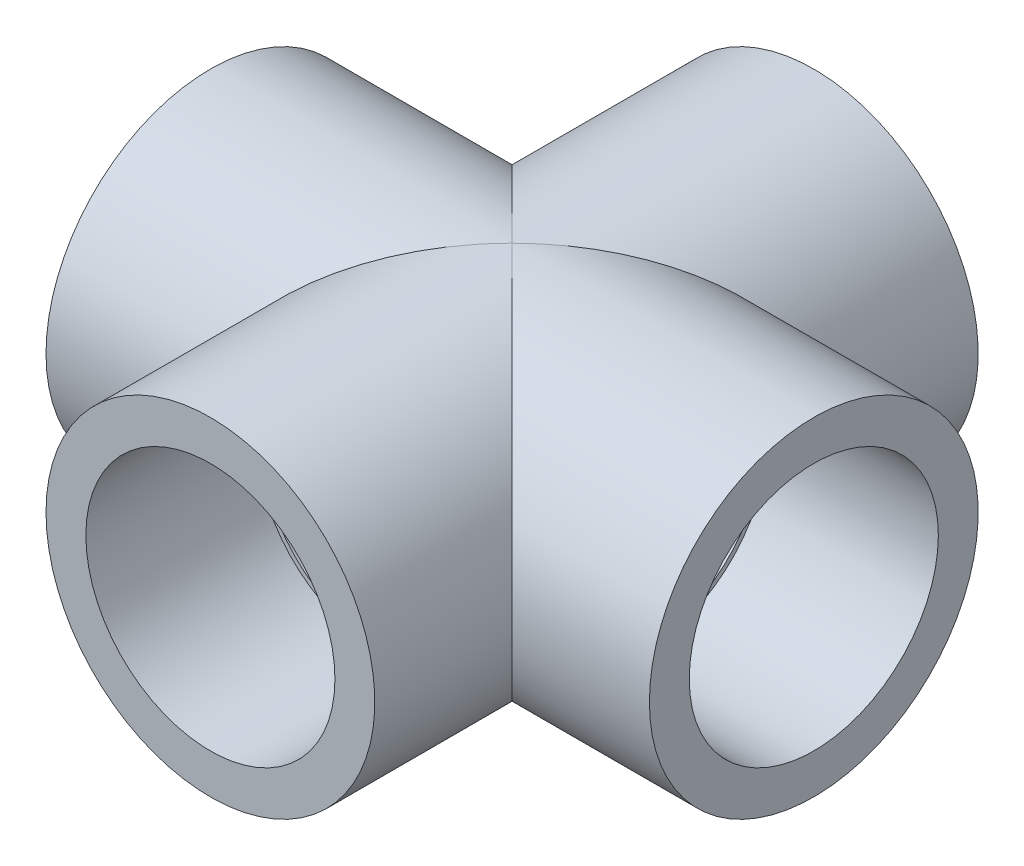
ISO-10303-21;
HEADER;
FILE_DESCRIPTION(('STEP AP214'),'2;1');
FILE_NAME('part.step','',(''),(''),'','','');
FILE_SCHEMA(('AUTOMOTIVE_DESIGN { 1 0 10303 214 1 1 1 1 }'));
ENDSEC;
DATA;
#1=APPLICATION_CONTEXT('core data for automotive mechanical design processes');
#2=APPLICATION_PROTOCOL_DEFINITION('international standard','automotive_design',2000,#1);
#3=PRODUCT_CONTEXT('',#1,'mechanical');
#4=PRODUCT('Part','Part','',(#3));
#5=PRODUCT_RELATED_PRODUCT_CATEGORY('part','',(#4));
#6=PRODUCT_DEFINITION_FORMATION('','',#4);
#7=PRODUCT_DEFINITION_CONTEXT('part definition',#1,'design');
#8=PRODUCT_DEFINITION('design','',#6,#7);
#9=PRODUCT_DEFINITION_SHAPE('','',#8);
#10=(LENGTH_UNIT() NAMED_UNIT(*) SI_UNIT(.MILLI.,.METRE.));
#11=(NAMED_UNIT(*) PLANE_ANGLE_UNIT() SI_UNIT($,.RADIAN.));
#12=(NAMED_UNIT(*) SI_UNIT($,.STERADIAN.) SOLID_ANGLE_UNIT());
#13=UNCERTAINTY_MEASURE_WITH_UNIT(LENGTH_MEASURE(1.E-05),#10,'distance_accuracy_value','');
#14=(GEOMETRIC_REPRESENTATION_CONTEXT(3) GLOBAL_UNCERTAINTY_ASSIGNED_CONTEXT((#13)) GLOBAL_UNIT_ASSIGNED_CONTEXT((#10,
#11,#12)) REPRESENTATION_CONTEXT('',''));
#15=CARTESIAN_POINT('',(0.,0.,0.));
#16=DIRECTION('',(0.,0.,1.));
#17=DIRECTION('',(1.,0.,0.));
#18=AXIS2_PLACEMENT_3D('',#15,#16,#17);
#19=CARTESIAN_POINT('',(0.,0.,17.));
#20=DIRECTION('',(-1.,0.,0.));
#21=DIRECTION('',(0.,0.,1.));
#22=AXIS2_PLACEMENT_3D('',#19,#20,#21);
#23=CYLINDRICAL_SURFACE('',#22,15.5);
#24=CARTESIAN_POINT('',(-17.,0.,17.));
#25=DIRECTION('',(-1.,0.,0.));
#26=DIRECTION('',(0.,0.,1.));
#27=AXIS2_PLACEMENT_3D('',#24,#25,#26);
#28=CIRCLE('',#27,15.5);
#29=CARTESIAN_POINT('',(-17.,0.,32.5));
#30=VERTEX_POINT('',#29);
#31=EDGE_CURVE('E47',#30,#30,#28,.T.);
#32=ORIENTED_EDGE('',*,*,#31,.T.);
#33=EDGE_LOOP('',(#32));
#34=FACE_BOUND('',#33,.T.);
#35=CARTESIAN_POINT('',(0.,0.,17.));
#36=DIRECTION('',(-0.707106781186547,0.,-0.707106781186547));
#37=DIRECTION('',(-0.707106781186547,0.,0.707106781186547));
#38=AXIS2_PLACEMENT_3D('',#35,#36,#37);
#39=ELLIPSE('',#38,21.920310216783,15.5);
#40=CARTESIAN_POINT('',(0.,15.5,17.));
#41=VERTEX_POINT('',#40);
#42=CARTESIAN_POINT('',(0.,-15.5,17.));
#43=VERTEX_POINT('',#42);
#44=EDGE_CURVE('E18',#41,#43,#39,.F.);
#45=ORIENTED_EDGE('',*,*,#44,.T.);
#46=CARTESIAN_POINT('',(0.,0.,17.));
#47=DIRECTION('',(-0.707106781186547,0.,0.707106781186547));
#48=DIRECTION('',(-0.707106781186547,0.,-0.707106781186547));
#49=AXIS2_PLACEMENT_3D('',#46,#47,#48);
#50=ELLIPSE('',#49,21.920310216783,15.5);
#51=EDGE_CURVE('E40',#43,#41,#50,.F.);
#52=ORIENTED_EDGE('',*,*,#51,.T.);
#53=EDGE_LOOP('',(#45,#52));
#54=FACE_BOUND('',#53,.T.);
#55=ADVANCED_FACE('F15',(#34,#54),#23,.F.);
#56=CARTESIAN_POINT('',(0.,0.,17.));
#57=DIRECTION('',(0.,0.,-1.));
#58=DIRECTION('',(-1.,0.,0.));
#59=AXIS2_PLACEMENT_3D('',#56,#57,#58);
#60=CYLINDRICAL_SURFACE('',#59,15.5);
#61=CARTESIAN_POINT('',(0.,0.,34.));
#62=DIRECTION('',(0.,0.,-1.));
#63=DIRECTION('',(-1.,0.,0.));
#64=AXIS2_PLACEMENT_3D('',#61,#62,#63);
#65=CIRCLE('',#64,15.5);
#66=CARTESIAN_POINT('',(-15.5,0.,34.));
#67=VERTEX_POINT('',#66);
#68=EDGE_CURVE('E55',#67,#67,#65,.F.);
#69=ORIENTED_EDGE('',*,*,#68,.T.);
#70=EDGE_LOOP('',(#69));
#71=FACE_BOUND('',#70,.T.);
#72=CARTESIAN_POINT('',(0.,0.,17.));
#73=DIRECTION('',(0.707106781186547,0.,-0.707106781186547));
#74=DIRECTION('',(-0.707106781186547,0.,-0.707106781186547));
#75=AXIS2_PLACEMENT_3D('',#72,#73,#74);
#76=ELLIPSE('',#75,21.920310216783,15.5);
#77=EDGE_CURVE('E51',#41,#43,#76,.T.);
#78=ORIENTED_EDGE('',*,*,#77,.T.);
#79=ORIENTED_EDGE('',*,*,#44,.F.);
#80=EDGE_LOOP('',(#78,#79));
#81=FACE_BOUND('',#80,.T.);
#82=ADVANCED_FACE('F54',(#71,#81),#60,.F.);
#83=CARTESIAN_POINT('',(-17.,0.,17.));
#84=DIRECTION('',(1.,0.,0.));
#85=DIRECTION('',(0.,0.,-1.));
#86=AXIS2_PLACEMENT_3D('',#83,#84,#85);
#87=PLANE('',#86);
#88=CARTESIAN_POINT('',(-17.,0.,17.));
#89=DIRECTION('',(1.,0.,0.));
#90=DIRECTION('',(0.,0.,-1.));
#91=AXIS2_PLACEMENT_3D('',#88,#89,#90);
#92=CIRCLE('',#91,16.1);
#93=CARTESIAN_POINT('',(-17.,0.,0.899999999999998));
#94=VERTEX_POINT('',#93);
#95=EDGE_CURVE('E63',#94,#94,#92,.F.);
#96=ORIENTED_EDGE('',*,*,#95,.T.);
#97=EDGE_LOOP('',(#96));
#98=FACE_BOUND('',#97,.T.);
#99=ORIENTED_EDGE('',*,*,#31,.F.);
#100=EDGE_LOOP('',(#99));
#101=FACE_BOUND('',#100,.T.);
#102=ADVANCED_FACE('F147',(#98,#101),#87,.F.);
#103=CARTESIAN_POINT('',(0.,0.,17.));
#104=DIRECTION('',(0.,0.,-1.));
#105=DIRECTION('',(-1.,0.,0.));
#106=AXIS2_PLACEMENT_3D('',#103,#104,#105);
#107=CYLINDRICAL_SURFACE('',#106,15.5);
#108=CARTESIAN_POINT('',(0.,0.,0.));
#109=DIRECTION('',(0.,0.,-1.));
#110=DIRECTION('',(-1.,0.,0.));
#111=AXIS2_PLACEMENT_3D('',#108,#109,#110);
#112=CIRCLE('',#111,15.5);
#113=CARTESIAN_POINT('',(-15.5,0.,0.));
#114=VERTEX_POINT('',#113);
#115=EDGE_CURVE('E66',#114,#114,#112,.T.);
#116=ORIENTED_EDGE('',*,*,#115,.T.);
#117=EDGE_LOOP('',(#116));
#118=FACE_BOUND('',#117,.T.);
#119=CARTESIAN_POINT('',(0.,0.,17.));
#120=DIRECTION('',(-0.707106781186547,0.,-0.707106781186547));
#121=DIRECTION('',(0.707106781186547,0.,-0.707106781186547));
#122=AXIS2_PLACEMENT_3D('',#119,#120,#121);
#123=ELLIPSE('',#122,21.920310216783,15.5);
#124=EDGE_CURVE('E49',#43,#41,#123,.F.);
#125=ORIENTED_EDGE('',*,*,#124,.T.);
#126=ORIENTED_EDGE('',*,*,#51,.F.);
#127=EDGE_LOOP('',(#125,#126));
#128=FACE_BOUND('',#127,.T.);
#129=ADVANCED_FACE('F57',(#118,#128),#107,.F.);
#130=CARTESIAN_POINT('',(0.,0.,17.));
#131=DIRECTION('',(-1.,0.,0.));
#132=DIRECTION('',(0.,0.,1.));
#133=AXIS2_PLACEMENT_3D('',#130,#131,#132);
#134=CYLINDRICAL_SURFACE('',#133,15.5);
#135=CARTESIAN_POINT('',(17.,0.,17.));
#136=DIRECTION('',(-1.,0.,0.));
#137=DIRECTION('',(0.,0.,1.));
#138=AXIS2_PLACEMENT_3D('',#135,#136,#137);
#139=CIRCLE('',#138,15.5);
#140=CARTESIAN_POINT('',(17.,0.,32.5));
#141=VERTEX_POINT('',#140);
#142=EDGE_CURVE('E69',#141,#141,#139,.F.);
#143=ORIENTED_EDGE('',*,*,#142,.T.);
#144=EDGE_LOOP('',(#143));
#145=FACE_BOUND('',#144,.T.);
#146=ORIENTED_EDGE('',*,*,#124,.F.);
#147=ORIENTED_EDGE('',*,*,#77,.F.);
#148=EDGE_LOOP('',(#146,#147));
#149=FACE_BOUND('',#148,.T.);
#150=ADVANCED_FACE('F50',(#145,#149),#134,.F.);
#151=CARTESIAN_POINT('',(0.,0.,34.));
#152=DIRECTION('',(0.,0.,-1.));
#153=DIRECTION('',(-1.,0.,0.));
#154=AXIS2_PLACEMENT_3D('',#151,#152,#153);
#155=PLANE('',#154);
#156=CARTESIAN_POINT('',(0.,0.,34.));
#157=DIRECTION('',(0.,0.,-1.));
#158=DIRECTION('',(-1.,0.,0.));
#159=AXIS2_PLACEMENT_3D('',#156,#157,#158);
#160=CIRCLE('',#159,16.1);
#161=CARTESIAN_POINT('',(-16.1,0.,34.));
#162=VERTEX_POINT('',#161);
#163=EDGE_CURVE('E72',#162,#162,#160,.F.);
#164=ORIENTED_EDGE('',*,*,#163,.T.);
#165=EDGE_LOOP('',(#164));
#166=FACE_BOUND('',#165,.T.);
#167=ORIENTED_EDGE('',*,*,#68,.F.);
#168=EDGE_LOOP('',(#167));
#169=FACE_BOUND('',#168,.T.);
#170=ADVANCED_FACE('F154',(#166,#169),#155,.F.);
#171=CARTESIAN_POINT('',(-28.,0.,17.));
#172=DIRECTION('',(1.,0.,0.));
#173=DIRECTION('',(0.,0.,-1.));
#174=AXIS2_PLACEMENT_3D('',#171,#172,#173);
#175=CYLINDRICAL_SURFACE('',#174,16.1);
#176=CARTESIAN_POINT('',(-39.,0.,17.));
#177=DIRECTION('',(1.,0.,0.));
#178=DIRECTION('',(0.,0.,-1.));
#179=AXIS2_PLACEMENT_3D('',#176,#177,#178);
#180=CIRCLE('',#179,16.1);
#181=CARTESIAN_POINT('',(-39.,0.,0.899999999999998));
#182=VERTEX_POINT('',#181);
#183=EDGE_CURVE('E75',#182,#182,#180,.T.);
#184=ORIENTED_EDGE('',*,*,#183,.F.);
#185=EDGE_LOOP('',(#184));
#186=FACE_BOUND('',#185,.T.);
#187=ORIENTED_EDGE('',*,*,#95,.F.);
#188=EDGE_LOOP('',(#187));
#189=FACE_BOUND('',#188,.T.);
#190=ADVANCED_FACE('F142',(#186,#189),#175,.F.);
#191=CARTESIAN_POINT('',(0.,0.,0.));
#192=DIRECTION('',(0.,0.,1.));
#193=DIRECTION('',(1.,0.,0.));
#194=AXIS2_PLACEMENT_3D('',#191,#192,#193);
#195=PLANE('',#194);
#196=CARTESIAN_POINT('',(0.,0.,0.));
#197=DIRECTION('',(0.,0.,-1.));
#198=DIRECTION('',(-1.,0.,0.));
#199=AXIS2_PLACEMENT_3D('',#196,#197,#198);
#200=CIRCLE('',#199,16.1);
#201=CARTESIAN_POINT('',(-16.1,0.,0.));
#202=VERTEX_POINT('',#201);
#203=EDGE_CURVE('E78',#202,#202,#200,.T.);
#204=ORIENTED_EDGE('',*,*,#203,.T.);
#205=EDGE_LOOP('',(#204));
#206=FACE_BOUND('',#205,.T.);
#207=ORIENTED_EDGE('',*,*,#115,.F.);
#208=EDGE_LOOP('',(#207));
#209=FACE_BOUND('',#208,.T.);
#210=ADVANCED_FACE('F138',(#206,#209),#195,.F.);
#211=CARTESIAN_POINT('',(17.,0.,17.));
#212=DIRECTION('',(-1.,0.,0.));
#213=DIRECTION('',(0.,0.,1.));
#214=AXIS2_PLACEMENT_3D('',#211,#212,#213);
#215=PLANE('',#214);
#216=CARTESIAN_POINT('',(17.,0.,17.));
#217=DIRECTION('',(-1.,0.,0.));
#218=DIRECTION('',(0.,0.,1.));
#219=AXIS2_PLACEMENT_3D('',#216,#217,#218);
#220=CIRCLE('',#219,16.1);
#221=CARTESIAN_POINT('',(17.,0.,33.1));
#222=VERTEX_POINT('',#221);
#223=EDGE_CURVE('E81',#222,#222,#220,.F.);
#224=ORIENTED_EDGE('',*,*,#223,.T.);
#225=EDGE_LOOP('',(#224));
#226=FACE_BOUND('',#225,.T.);
#227=ORIENTED_EDGE('',*,*,#142,.F.);
#228=EDGE_LOOP('',(#227));
#229=FACE_BOUND('',#228,.T.);
#230=ADVANCED_FACE('F141',(#226,#229),#215,.F.);
#231=CARTESIAN_POINT('',(0.,0.,45.));
#232=DIRECTION('',(0.,0.,-1.));
#233=DIRECTION('',(-1.,0.,0.));
#234=AXIS2_PLACEMENT_3D('',#231,#232,#233);
#235=CYLINDRICAL_SURFACE('',#234,16.1);
#236=CARTESIAN_POINT('',(0.,0.,56.));
#237=DIRECTION('',(0.,0.,-1.));
#238=DIRECTION('',(-1.,0.,0.));
#239=AXIS2_PLACEMENT_3D('',#236,#237,#238);
#240=CIRCLE('',#239,16.1);
#241=CARTESIAN_POINT('',(-16.1,0.,56.));
#242=VERTEX_POINT('',#241);
#243=EDGE_CURVE('E84',#242,#242,#240,.T.);
#244=ORIENTED_EDGE('',*,*,#243,.F.);
#245=EDGE_LOOP('',(#244));
#246=FACE_BOUND('',#245,.T.);
#247=ORIENTED_EDGE('',*,*,#163,.F.);
#248=EDGE_LOOP('',(#247));
#249=FACE_BOUND('',#248,.T.);
#250=ADVANCED_FACE('F182',(#246,#249),#235,.F.);
#251=CARTESIAN_POINT('',(-39.,0.,17.));
#252=DIRECTION('',(-1.,0.,0.));
#253=DIRECTION('',(0.,0.,1.));
#254=AXIS2_PLACEMENT_3D('',#251,#252,#253);
#255=PLANE('',#254);
#256=CARTESIAN_POINT('',(-39.,0.,17.));
#257=DIRECTION('',(-1.,0.,0.));
#258=DIRECTION('',(0.,0.,1.));
#259=AXIS2_PLACEMENT_3D('',#256,#257,#258);
#260=CIRCLE('',#259,21.25);
#261=CARTESIAN_POINT('',(-39.,0.,38.25));
#262=VERTEX_POINT('',#261);
#263=EDGE_CURVE('E87',#262,#262,#260,.F.);
#264=ORIENTED_EDGE('',*,*,#263,.F.);
#265=EDGE_LOOP('',(#264));
#266=FACE_BOUND('',#265,.T.);
#267=ORIENTED_EDGE('',*,*,#183,.T.);
#268=EDGE_LOOP('',(#267));
#269=FACE_BOUND('',#268,.T.);
#270=ADVANCED_FACE('F134',(#266,#269),#255,.T.);
#271=CARTESIAN_POINT('',(0.,0.,-11.));
#272=DIRECTION('',(0.,0.,-1.));
#273=DIRECTION('',(-1.,0.,0.));
#274=AXIS2_PLACEMENT_3D('',#271,#272,#273);
#275=CYLINDRICAL_SURFACE('',#274,16.1);
#276=CARTESIAN_POINT('',(0.,0.,-22.));
#277=DIRECTION('',(0.,0.,-1.));
#278=DIRECTION('',(-1.,0.,0.));
#279=AXIS2_PLACEMENT_3D('',#276,#277,#278);
#280=CIRCLE('',#279,16.1);
#281=CARTESIAN_POINT('',(-16.1,0.,-22.));
#282=VERTEX_POINT('',#281);
#283=EDGE_CURVE('E90',#282,#282,#280,.F.);
#284=ORIENTED_EDGE('',*,*,#283,.F.);
#285=EDGE_LOOP('',(#284));
#286=FACE_BOUND('',#285,.T.);
#287=ORIENTED_EDGE('',*,*,#203,.F.);
#288=EDGE_LOOP('',(#287));
#289=FACE_BOUND('',#288,.T.);
#290=ADVANCED_FACE('F130',(#286,#289),#275,.F.);
#291=CARTESIAN_POINT('',(28.,0.,17.));
#292=DIRECTION('',(-1.,0.,0.));
#293=DIRECTION('',(0.,0.,1.));
#294=AXIS2_PLACEMENT_3D('',#291,#292,#293);
#295=CYLINDRICAL_SURFACE('',#294,16.1);
#296=CARTESIAN_POINT('',(39.,0.,17.));
#297=DIRECTION('',(-1.,0.,0.));
#298=DIRECTION('',(0.,0.,1.));
#299=AXIS2_PLACEMENT_3D('',#296,#297,#298);
#300=CIRCLE('',#299,16.1);
#301=CARTESIAN_POINT('',(39.,0.,33.1));
#302=VERTEX_POINT('',#301);
#303=EDGE_CURVE('E93',#302,#302,#300,.T.);
#304=ORIENTED_EDGE('',*,*,#303,.F.);
#305=EDGE_LOOP('',(#304));
#306=FACE_BOUND('',#305,.T.);
#307=ORIENTED_EDGE('',*,*,#223,.F.);
#308=EDGE_LOOP('',(#307));
#309=FACE_BOUND('',#308,.T.);
#310=ADVANCED_FACE('F133',(#306,#309),#295,.F.);
#311=CARTESIAN_POINT('',(0.,0.,56.));
#312=DIRECTION('',(0.,0.,1.));
#313=DIRECTION('',(1.,0.,0.));
#314=AXIS2_PLACEMENT_3D('',#311,#312,#313);
#315=PLANE('',#314);
#316=CARTESIAN_POINT('',(0.,0.,56.));
#317=DIRECTION('',(0.,0.,-1.));
#318=DIRECTION('',(-1.,0.,0.));
#319=AXIS2_PLACEMENT_3D('',#316,#317,#318);
#320=CIRCLE('',#319,21.25);
#321=CARTESIAN_POINT('',(-21.25,0.,56.));
#322=VERTEX_POINT('',#321);
#323=EDGE_CURVE('E96',#322,#322,#320,.T.);
#324=ORIENTED_EDGE('',*,*,#323,.F.);
#325=EDGE_LOOP('',(#324));
#326=FACE_BOUND('',#325,.T.);
#327=ORIENTED_EDGE('',*,*,#243,.T.);
#328=EDGE_LOOP('',(#327));
#329=FACE_BOUND('',#328,.T.);
#330=ADVANCED_FACE('F173',(#326,#329),#315,.T.);
#331=CARTESIAN_POINT('',(0.,0.,17.));
#332=DIRECTION('',(-1.,0.,0.));
#333=DIRECTION('',(0.,0.,1.));
#334=AXIS2_PLACEMENT_3D('',#331,#332,#333);
#335=CYLINDRICAL_SURFACE('',#334,21.25);
#336=CARTESIAN_POINT('',(0.,0.,17.));
#337=DIRECTION('',(-0.707106781186547,0.,-0.707106781186547));
#338=DIRECTION('',(-0.707106781186547,0.,0.707106781186547));
#339=AXIS2_PLACEMENT_3D('',#336,#337,#338);
#340=ELLIPSE('',#339,30.0520382004283,21.25);
#341=CARTESIAN_POINT('',(0.,21.25,17.));
#342=VERTEX_POINT('',#341);
#343=CARTESIAN_POINT('',(0.,-21.25,17.));
#344=VERTEX_POINT('',#343);
#345=EDGE_CURVE('E99',#342,#344,#340,.F.);
#346=ORIENTED_EDGE('',*,*,#345,.F.);
#347=CARTESIAN_POINT('',(0.,0.,17.));
#348=DIRECTION('',(-0.707106781186547,0.,0.707106781186547));
#349=DIRECTION('',(-0.707106781186547,0.,-0.707106781186547));
#350=AXIS2_PLACEMENT_3D('',#347,#348,#349);
#351=ELLIPSE('',#350,30.0520382004283,21.25);
#352=EDGE_CURVE('E32',#344,#342,#351,.F.);
#353=ORIENTED_EDGE('',*,*,#352,.F.);
#354=EDGE_LOOP('',(#346,#353));
#355=FACE_BOUND('',#354,.T.);
#356=ORIENTED_EDGE('',*,*,#263,.T.);
#357=EDGE_LOOP('',(#356));
#358=FACE_BOUND('',#357,.T.);
#359=ADVANCED_FACE('F126',(#355,#358),#335,.T.);
#360=CARTESIAN_POINT('',(0.,0.,-22.));
#361=DIRECTION('',(0.,0.,-1.));
#362=DIRECTION('',(-1.,0.,0.));
#363=AXIS2_PLACEMENT_3D('',#360,#361,#362);
#364=PLANE('',#363);
#365=CARTESIAN_POINT('',(0.,0.,-22.));
#366=DIRECTION('',(0.,0.,-1.));
#367=DIRECTION('',(-1.,0.,0.));
#368=AXIS2_PLACEMENT_3D('',#365,#366,#367);
#369=CIRCLE('',#368,21.25);
#370=CARTESIAN_POINT('',(-21.25,0.,-22.));
#371=VERTEX_POINT('',#370);
#372=EDGE_CURVE('E102',#371,#371,#369,.F.);
#373=ORIENTED_EDGE('',*,*,#372,.F.);
#374=EDGE_LOOP('',(#373));
#375=FACE_BOUND('',#374,.T.);
#376=ORIENTED_EDGE('',*,*,#283,.T.);
#377=EDGE_LOOP('',(#376));
#378=FACE_BOUND('',#377,.T.);
#379=ADVANCED_FACE('F122',(#375,#378),#364,.T.);
#380=CARTESIAN_POINT('',(39.,0.,17.));
#381=DIRECTION('',(1.,0.,0.));
#382=DIRECTION('',(0.,0.,-1.));
#383=AXIS2_PLACEMENT_3D('',#380,#381,#382);
#384=PLANE('',#383);
#385=CARTESIAN_POINT('',(39.,0.,17.));
#386=DIRECTION('',(-1.,0.,0.));
#387=DIRECTION('',(0.,0.,1.));
#388=AXIS2_PLACEMENT_3D('',#385,#386,#387);
#389=CIRCLE('',#388,21.25);
#390=CARTESIAN_POINT('',(39.,0.,38.25));
#391=VERTEX_POINT('',#390);
#392=EDGE_CURVE('E105',#391,#391,#389,.T.);
#393=ORIENTED_EDGE('',*,*,#392,.F.);
#394=EDGE_LOOP('',(#393));
#395=FACE_BOUND('',#394,.T.);
#396=ORIENTED_EDGE('',*,*,#303,.T.);
#397=EDGE_LOOP('',(#396));
#398=FACE_BOUND('',#397,.T.);
#399=ADVANCED_FACE('F125',(#395,#398),#384,.T.);
#400=CARTESIAN_POINT('',(0.,0.,17.));
#401=DIRECTION('',(0.,0.,-1.));
#402=DIRECTION('',(-1.,0.,0.));
#403=AXIS2_PLACEMENT_3D('',#400,#401,#402);
#404=CYLINDRICAL_SURFACE('',#403,21.25);
#405=ORIENTED_EDGE('',*,*,#323,.T.);
#406=EDGE_LOOP('',(#405));
#407=FACE_BOUND('',#406,.T.);
#408=ORIENTED_EDGE('',*,*,#345,.T.);
#409=CARTESIAN_POINT('',(0.,0.,17.));
#410=DIRECTION('',(0.707106781186547,0.,-0.707106781186547));
#411=DIRECTION('',(-0.707106781186547,0.,-0.707106781186547));
#412=AXIS2_PLACEMENT_3D('',#409,#410,#411);
#413=ELLIPSE('',#412,30.0520382004283,21.25);
#414=EDGE_CURVE('E24',#342,#344,#413,.T.);
#415=ORIENTED_EDGE('',*,*,#414,.F.);
#416=EDGE_LOOP('',(#408,#415));
#417=FACE_BOUND('',#416,.T.);
#418=ADVANCED_FACE('F114',(#407,#417),#404,.T.);
#419=CARTESIAN_POINT('',(0.,0.,17.));
#420=DIRECTION('',(0.,0.,-1.));
#421=DIRECTION('',(-1.,0.,0.));
#422=AXIS2_PLACEMENT_3D('',#419,#420,#421);
#423=CYLINDRICAL_SURFACE('',#422,21.25);
#424=ORIENTED_EDGE('',*,*,#352,.T.);
#425=CARTESIAN_POINT('',(0.,0.,17.));
#426=DIRECTION('',(-0.707106781186547,0.,-0.707106781186547));
#427=DIRECTION('',(-0.707106781186547,0.,0.707106781186547));
#428=AXIS2_PLACEMENT_3D('',#425,#426,#427);
#429=ELLIPSE('',#428,30.0520382004283,21.25);
#430=EDGE_CURVE('E9',#344,#342,#429,.F.);
#431=ORIENTED_EDGE('',*,*,#430,.F.);
#432=EDGE_LOOP('',(#424,#431));
#433=FACE_BOUND('',#432,.T.);
#434=ORIENTED_EDGE('',*,*,#372,.T.);
#435=EDGE_LOOP('',(#434));
#436=FACE_BOUND('',#435,.T.);
#437=ADVANCED_FACE('F116',(#433,#436),#423,.T.);
#438=CARTESIAN_POINT('',(0.,0.,17.));
#439=DIRECTION('',(-1.,0.,0.));
#440=DIRECTION('',(0.,0.,1.));
#441=AXIS2_PLACEMENT_3D('',#438,#439,#440);
#442=CYLINDRICAL_SURFACE('',#441,21.25);
#443=ORIENTED_EDGE('',*,*,#392,.T.);
#444=EDGE_LOOP('',(#443));
#445=FACE_BOUND('',#444,.T.);
#446=ORIENTED_EDGE('',*,*,#414,.T.);
#447=ORIENTED_EDGE('',*,*,#430,.T.);
#448=EDGE_LOOP('',(#446,#447));
#449=FACE_BOUND('',#448,.T.);
#450=ADVANCED_FACE('F111',(#445,#449),#442,.T.);
#451=CLOSED_SHELL('',(#55,#82,#102,#129,#150,#170,#190,#210,#230,#250,#270,#290,#310,#330,#359,
#379,#399,#418,#437,#450));
#452=MANIFOLD_SOLID_BREP('B1',#451);
#453=ADVANCED_BREP_SHAPE_REPRESENTATION('',(#18,#452),#14);
#454=SHAPE_DEFINITION_REPRESENTATION(#9,#453);
ENDSEC;
END-ISO-10303-21;
